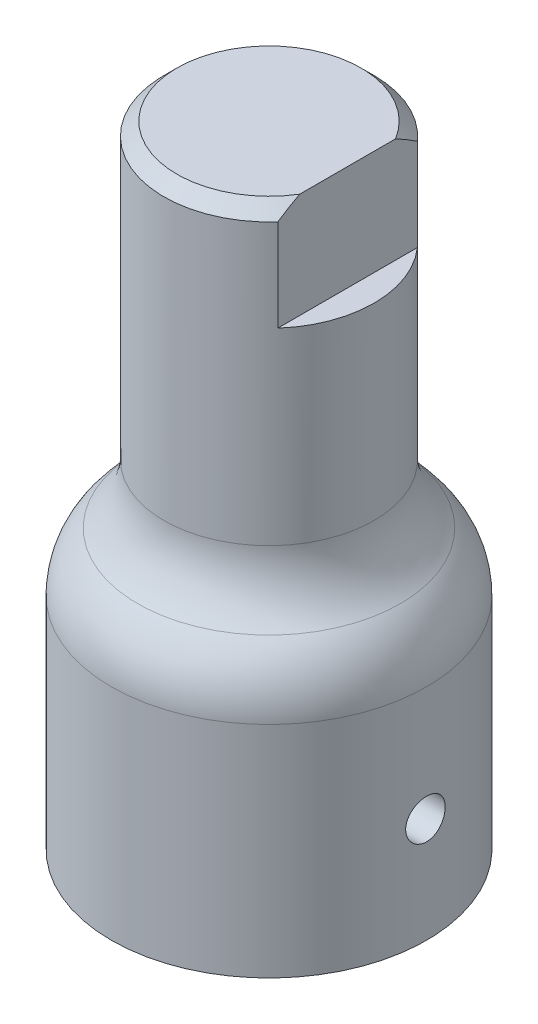
ISO-10303-21;
HEADER;
FILE_DESCRIPTION(('STEP AP214'),'2;1');
FILE_NAME('part.step','',(''),(''),'','','');
FILE_SCHEMA(('AUTOMOTIVE_DESIGN { 1 0 10303 214 1 1 1 1 }'));
ENDSEC;
DATA;
#1=APPLICATION_CONTEXT('core data for automotive mechanical design processes');
#2=APPLICATION_PROTOCOL_DEFINITION('international standard','automotive_design',2000,#1);
#3=PRODUCT_CONTEXT('',#1,'mechanical');
#4=PRODUCT('Part','Part','',(#3));
#5=PRODUCT_RELATED_PRODUCT_CATEGORY('part','',(#4));
#6=PRODUCT_DEFINITION_FORMATION('','',#4);
#7=PRODUCT_DEFINITION_CONTEXT('part definition',#1,'design');
#8=PRODUCT_DEFINITION('design','',#6,#7);
#9=PRODUCT_DEFINITION_SHAPE('','',#8);
#10=(LENGTH_UNIT() NAMED_UNIT(*) SI_UNIT(.MILLI.,.METRE.));
#11=(NAMED_UNIT(*) PLANE_ANGLE_UNIT() SI_UNIT($,.RADIAN.));
#12=(NAMED_UNIT(*) SI_UNIT($,.STERADIAN.) SOLID_ANGLE_UNIT());
#13=UNCERTAINTY_MEASURE_WITH_UNIT(LENGTH_MEASURE(1.E-05),#10,'distance_accuracy_value','');
#14=(GEOMETRIC_REPRESENTATION_CONTEXT(3) GLOBAL_UNCERTAINTY_ASSIGNED_CONTEXT((#13)) GLOBAL_UNIT_ASSIGNED_CONTEXT((#10,
#11,#12)) REPRESENTATION_CONTEXT('',''));
#15=CARTESIAN_POINT('',(0.,0.,0.));
#16=DIRECTION('',(0.,0.,1.));
#17=DIRECTION('',(1.,0.,0.));
#18=AXIS2_PLACEMENT_3D('',#15,#16,#17);
#19=CARTESIAN_POINT('',(0.,38.1,0.));
#20=DIRECTION('',(0.,-1.,0.));
#21=DIRECTION('',(0.,0.,-1.));
#22=AXIS2_PLACEMENT_3D('',#19,#20,#21);
#23=CYLINDRICAL_SURFACE('',#22,6.35);
#24=DIRECTION('',(0.,1.,0.));
#25=VECTOR('',#24,1.);
#26=CARTESIAN_POINT('',(4.7498,31.75,4.21448691539076));
#27=LINE('',#26,#25);
#28=CARTESIAN_POINT('',(4.7498,31.75,4.21448691539076));
#29=VERTEX_POINT('',#28);
#30=CARTESIAN_POINT('',(4.7498,37.3126,4.21448691539076));
#31=VERTEX_POINT('',#30);
#32=EDGE_CURVE('E111',#29,#31,#27,.T.);
#33=ORIENTED_EDGE('',*,*,#32,.T.);
#34=CARTESIAN_POINT('',(0.,37.3126,0.));
#35=DIRECTION('',(0.,1.,0.));
#36=DIRECTION('',(0.,0.,1.));
#37=AXIS2_PLACEMENT_3D('',#34,#35,#36);
#38=CIRCLE('',#37,6.35);
#39=CARTESIAN_POINT('',(4.7498,37.3126,-4.21448691539077));
#40=VERTEX_POINT('',#39);
#41=EDGE_CURVE('E135',#31,#40,#38,.F.);
#42=ORIENTED_EDGE('',*,*,#41,.T.);
#43=DIRECTION('',(0.,1.,0.));
#44=VECTOR('',#43,1.);
#45=CARTESIAN_POINT('',(4.7498,31.75,-4.21448691539077));
#46=LINE('',#45,#44);
#47=CARTESIAN_POINT('',(4.7498,31.75,-4.21448691539077));
#48=VERTEX_POINT('',#47);
#49=EDGE_CURVE('E109',#48,#40,#46,.T.);
#50=ORIENTED_EDGE('',*,*,#49,.F.);
#51=CARTESIAN_POINT('',(0.,31.75,0.));
#52=DIRECTION('',(0.,1.,0.));
#53=DIRECTION('',(0.,0.,1.));
#54=AXIS2_PLACEMENT_3D('',#51,#52,#53);
#55=CIRCLE('',#54,6.35);
#56=EDGE_CURVE('E104',#29,#48,#55,.T.);
#57=ORIENTED_EDGE('',*,*,#56,.F.);
#58=EDGE_LOOP('',(#33,#42,#50,#57));
#59=FACE_BOUND('',#58,.T.);
#60=CARTESIAN_POINT('',(0.,20.3740993543153,0.));
#61=DIRECTION('',(0.,-1.,0.));
#62=DIRECTION('',(0.,0.,-1.));
#63=AXIS2_PLACEMENT_3D('',#60,#61,#62);
#64=CIRCLE('',#63,6.35000000000001);
#65=CARTESIAN_POINT('',(0.,20.3740993543153,-6.35000000000001));
#66=VERTEX_POINT('',#65);
#67=EDGE_CURVE('E114',#66,#66,#64,.T.);
#68=ORIENTED_EDGE('',*,*,#67,.F.);
#69=EDGE_LOOP('',(#68));
#70=FACE_BOUND('',#69,.T.);
#71=ADVANCED_FACE('F32',(#59,#70),#23,.T.);
#72=CARTESIAN_POINT('',(6.35,38.1,0.));
#73=DIRECTION('',(0.,1.,0.));
#74=DIRECTION('',(0.,0.,1.));
#75=AXIS2_PLACEMENT_3D('',#72,#73,#74);
#76=PLANE('',#75);
#77=DIRECTION('',(0.,0.,1.));
#78=VECTOR('',#77,1.);
#79=CARTESIAN_POINT('',(4.7498,38.1,-4.21448691539077));
#80=LINE('',#79,#78);
#81=CARTESIAN_POINT('',(4.7498,38.1,-2.89515435167112));
#82=VERTEX_POINT('',#81);
#83=CARTESIAN_POINT('',(4.7498,38.1,2.89515435167112));
#84=VERTEX_POINT('',#83);
#85=EDGE_CURVE('E102',#82,#84,#80,.T.);
#86=ORIENTED_EDGE('',*,*,#85,.F.);
#87=CARTESIAN_POINT('',(0.,38.1,0.));
#88=DIRECTION('',(0.,1.,0.));
#89=DIRECTION('',(0.,0.,1.));
#90=AXIS2_PLACEMENT_3D('',#87,#88,#89);
#91=CIRCLE('',#90,5.56260000000002);
#92=EDGE_CURVE('E11',#82,#84,#91,.T.);
#93=ORIENTED_EDGE('',*,*,#92,.T.);
#94=EDGE_LOOP('',(#86,#93));
#95=FACE_BOUND('',#94,.T.);
#96=ADVANCED_FACE('F185',(#95),#76,.T.);
#97=CARTESIAN_POINT('',(0.,0.,0.));
#98=DIRECTION('',(0.,-1.,0.));
#99=DIRECTION('',(0.,0.,-1.));
#100=AXIS2_PLACEMENT_3D('',#97,#98,#99);
#101=PLANE('',#100);
#102=CARTESIAN_POINT('',(0.,0.,0.));
#103=DIRECTION('',(0.,-1.,0.));
#104=DIRECTION('',(0.,0.,-1.));
#105=AXIS2_PLACEMENT_3D('',#102,#103,#104);
#106=CIRCLE('',#105,6.35);
#107=CARTESIAN_POINT('',(4.7498,0.,4.21448691539076));
#108=VERTEX_POINT('',#107);
#109=CARTESIAN_POINT('',(4.7498,0.,-4.21448691539076));
#110=VERTEX_POINT('',#109);
#111=EDGE_CURVE('E83',#108,#110,#106,.T.);
#112=ORIENTED_EDGE('',*,*,#111,.F.);
#113=DIRECTION('',(0.,0.,1.));
#114=VECTOR('',#113,1.);
#115=CARTESIAN_POINT('',(4.7498,0.,-4.21448691539076));
#116=LINE('',#115,#114);
#117=EDGE_CURVE('E93',#110,#108,#116,.T.);
#118=ORIENTED_EDGE('',*,*,#117,.F.);
#119=EDGE_LOOP('',(#112,#118));
#120=FACE_BOUND('',#119,.T.);
#121=CARTESIAN_POINT('',(0.,0.,0.));
#122=DIRECTION('',(0.,-1.,0.));
#123=DIRECTION('',(0.,0.,-1.));
#124=AXIS2_PLACEMENT_3D('',#121,#122,#123);
#125=CIRCLE('',#124,9.525);
#126=CARTESIAN_POINT('',(0.,0.,-9.525));
#127=VERTEX_POINT('',#126);
#128=EDGE_CURVE('E124',#127,#127,#125,.T.);
#129=ORIENTED_EDGE('',*,*,#128,.T.);
#130=EDGE_LOOP('',(#129));
#131=FACE_BOUND('',#130,.T.);
#132=ADVANCED_FACE('F189',(#120,#131),#101,.T.);
#133=CARTESIAN_POINT('',(0.,38.1,0.));
#134=DIRECTION('',(0.,-1.,0.));
#135=DIRECTION('',(0.,0.,-1.));
#136=AXIS2_PLACEMENT_3D('',#133,#134,#135);
#137=CYLINDRICAL_SURFACE('',#136,9.525);
#138=CARTESIAN_POINT('',(9.52500000000001,5.15620000000001,0.));
#139=CARTESIAN_POINT('',(9.52499906633393,5.15620283595176,-0.0667754370927595));
#140=CARTESIAN_POINT('',(9.52429038644981,5.16182153593911,-0.133592564440605));
#141=CARTESIAN_POINT('',(9.52153149004273,5.18414687968143,-0.265367426049692));
#142=CARTESIAN_POINT('',(9.51947987393368,5.200865091425,-0.330323146585073));
#143=CARTESIAN_POINT('',(9.51426622373616,5.244889075905,-0.456448414925353));
#144=CARTESIAN_POINT('',(9.51110493832651,5.2721877114633,-0.51762048286043));
#145=CARTESIAN_POINT('',(9.50402352104194,5.33658200765826,-0.63450350010949));
#146=CARTESIAN_POINT('',(9.50010351906838,5.37367599160944,-0.690215381816632));
#147=CARTESIAN_POINT('',(9.49191805864054,5.45682745546026,-0.79491643197807));
#148=CARTESIAN_POINT('',(9.48765098944923,5.50292830543591,-0.843871034353107));
#149=CARTESIAN_POINT('',(9.47926530284555,5.60269175422189,-0.93337018896483));
#150=CARTESIAN_POINT('',(9.47514669302021,5.65635473880845,-0.973914311886643));
#151=CARTESIAN_POINT('',(9.46750838779676,5.76994385510924,-1.04557040884552));
#152=CARTESIAN_POINT('',(9.46399076707647,5.82989057420486,-1.07664998800913));
#153=CARTESIAN_POINT('',(9.45797395706645,5.95420398517649,-1.12828787594043));
#154=CARTESIAN_POINT('',(9.45547472895526,6.01857050845878,-1.14884658577483));
#155=CARTESIAN_POINT('',(9.45179305517668,6.149537618023,-1.17875409313682));
#156=CARTESIAN_POINT('',(9.45060375528388,6.21612467881391,-1.18816126126591));
#157=CARTESIAN_POINT('',(9.44965561667631,6.34994221256467,-1.19567927082564));
#158=CARTESIAN_POINT('',(9.4498967201401,6.41717265940713,-1.19379056887112));
#159=CARTESIAN_POINT('',(9.45177587435601,6.54996167391498,-1.17881836472275));
#160=CARTESIAN_POINT('',(9.45340590037559,6.61552762199898,-1.16579916937844));
#161=CARTESIAN_POINT('',(9.45786671902315,6.74353674388769,-1.12903588387259));
#162=CARTESIAN_POINT('',(9.46069753609851,6.80597985408437,-1.10529157535362));
#163=CARTESIAN_POINT('',(9.46725006865937,6.92617049382943,-1.04768298427782));
#164=CARTESIAN_POINT('',(9.47097423777249,6.98390449394819,-1.01379076530585));
#165=CARTESIAN_POINT('',(9.47889195626249,7.09288980034073,-0.936868413344563));
#166=CARTESIAN_POINT('',(9.48308552721859,7.14414080834906,-0.893837860168287));
#167=CARTESIAN_POINT('',(9.49150520562213,7.23907855234493,-0.799503970388438));
#168=CARTESIAN_POINT('',(9.495731336605,7.28271023041676,-0.748145206526462));
#169=CARTESIAN_POINT('',(9.50371268165858,7.36074204871934,-0.638803602449942));
#170=CARTESIAN_POINT('',(9.50746789463348,7.39514216746904,-0.580820746822149));
#171=CARTESIAN_POINT('',(9.51408664109903,7.4537344503723,-0.459834355321201));
#172=CARTESIAN_POINT('',(9.51694987250399,7.47792315722933,-0.396829127583732));
#173=CARTESIAN_POINT('',(9.52145930725312,7.51536222731489,-0.267607404435745));
#174=CARTESIAN_POINT('',(9.5231055678795,7.52861310538504,-0.201391060327244));
#175=CARTESIAN_POINT('',(9.52498812349274,7.54372899184481,-0.0681027909533295));
#176=CARTESIAN_POINT('',(9.5252338102757,7.54566984357767,-0.0010395943138036));
#177=CARTESIAN_POINT('',(9.52431289584841,7.53831074963159,0.132456074285859));
#178=CARTESIAN_POINT('',(9.52314632487864,7.52901104464508,0.198888559720625));
#179=CARTESIAN_POINT('',(9.51953782920002,7.49949782814167,0.329013169628924));
#180=CARTESIAN_POINT('',(9.51710013238404,7.47932048924539,0.392713625542354));
#181=CARTESIAN_POINT('',(9.51122230002441,7.42866237993011,0.515826637436894));
#182=CARTESIAN_POINT('',(9.50778213027829,7.39818125795998,0.575239047031721));
#183=CARTESIAN_POINT('',(9.50025946857067,7.32759739980978,0.688428119930082));
#184=CARTESIAN_POINT('',(9.49617373997876,7.28744561533005,0.742173978276366));
#185=CARTESIAN_POINT('',(9.4878271038743,7.19872957115728,0.842190867080791));
#186=CARTESIAN_POINT('',(9.48356618937484,7.1501649756888,0.888461599046223));
#187=CARTESIAN_POINT('',(9.47532042798572,7.04566775433998,0.972483952683192));
#188=CARTESIAN_POINT('',(9.47133730098763,6.98969454345516,1.01018529284971));
#189=CARTESIAN_POINT('',(9.46412640729675,6.87216586251836,1.07565126763209));
#190=CARTESIAN_POINT('',(9.46089862539395,6.81061050490585,1.10341610234024));
#191=CARTESIAN_POINT('',(9.45557559845436,6.68382694974683,1.14813956500274));
#192=CARTESIAN_POINT('',(9.45347738693838,6.61860887421039,1.1651265190246));
#193=CARTESIAN_POINT('',(9.45064256143378,6.48621796936088,1.1879032272318));
#194=CARTESIAN_POINT('',(9.44990588373722,6.41904523165841,1.19369350532486));
#195=CARTESIAN_POINT('',(9.44987939670947,6.28515204049117,1.19390285050628));
#196=CARTESIAN_POINT('',(9.4505795360166,6.21843169875243,1.18840091311061));
#197=CARTESIAN_POINT('',(9.45332618160548,6.08687204689658,1.16634931287982));
#198=CARTESIAN_POINT('',(9.4553726880076,6.02203273694766,1.14979964905699));
#199=CARTESIAN_POINT('',(9.46057836361699,5.89608623299099,1.10614711786605));
#200=CARTESIAN_POINT('',(9.46373712939881,5.83497769521926,1.07904807646655));
#201=CARTESIAN_POINT('',(9.47081207403943,5.71816255267193,1.01507380847755));
#202=CARTESIAN_POINT('',(9.47472826258874,5.6624560170236,0.978198456807015));
#203=CARTESIAN_POINT('',(9.482909615424,5.55762241006486,0.895425331094883));
#204=CARTESIAN_POINT('',(9.4871769445936,5.5085419846983,0.849468688981135));
#205=CARTESIAN_POINT('',(9.49556065827223,5.418759320745,0.749960302348609));
#206=CARTESIAN_POINT('',(9.49967700696157,5.37805905989685,0.696406769970906));
#207=CARTESIAN_POINT('',(9.5073123408521,5.30605952563161,0.582989947177679));
#208=CARTESIAN_POINT('',(9.51082898240688,5.27479678339242,0.523103319473923));
#209=CARTESIAN_POINT('',(9.51684491833686,5.22281637200474,0.39891943647175));
#210=CARTESIAN_POINT('',(9.51934531691388,5.20208725135372,0.334627057531768));
#211=CARTESIAN_POINT('',(9.52244469822355,5.17672112812424,0.225002223150388));
#212=CARTESIAN_POINT('',(9.52339826480289,5.16903677394111,0.180360864683001));
#213=CARTESIAN_POINT('',(9.52467622971936,5.15877526790845,0.0904860500245009));
#214=CARTESIAN_POINT('',(9.52500063272991,5.15619807812289,0.0452525982339693));
#215=CARTESIAN_POINT('',(9.52500000000001,5.15620000000001,0.));
#216=B_SPLINE_CURVE_WITH_KNOTS('',3,(#138,#139,#140,#141,#142,#143,#144,#145,#146,#147,#148,
#149,#150,#151,#152,#153,#154,#155,#156,#157,#158,#159,#160,#161,#162,#163,#164,#165,#166,#167,
#168,#169,#170,#171,#172,#173,#174,#175,#176,#177,#178,#179,#180,#181,#182,#183,#184,#185,#186,
#187,#188,#189,#190,#191,#192,#193,#194,#195,#196,#197,#198,#199,#200,#201,#202,#203,#204,#205,
#206,#207,#208,#209,#210,#211,#212,#213,#214,#215),.UNSPECIFIED.,.T.,.F.,(4,2,2,2,2,2,2,2,2,2,2,
2,2,2,2,2,2,2,2,2,2,2,2,2,2,2,2,2,2,2,2,2,2,2,2,2,2,2,4),(0.,0.200161016939101,
0.400530971246862,0.600765997685618,0.800966771766328,1.0021564359706,1.20335636742217,
1.40523741216748,1.60711076041968,1.80792270891501,2.00872654001029,2.20837799937318,
2.40803352371366,2.60824381841026,2.80846332090918,3.01007460714598,3.21168636251097,
3.41336632330053,3.61503679050939,3.81535331535247,4.01566555092253,4.2153157379614,
4.41497273748225,4.6156645228111,4.81636432007613,5.01821296945347,5.22005755395817,
5.42136943555335,5.62267189726344,5.82257093363813,6.02246998788479,6.22229661169174,
6.42212579226354,6.623295543038,6.82451271606741,7.02649906683712,7.22826535820902,
7.36391214328652,7.49955792077601),.UNSPECIFIED.);
#217=CARTESIAN_POINT('',(9.52500000000001,5.15620000000001,0.));
#218=VERTEX_POINT('',#217);
#219=EDGE_CURVE('E127',#218,#218,#216,.T.);
#220=ORIENTED_EDGE('',*,*,#219,.F.);
#221=EDGE_LOOP('',(#220));
#222=FACE_BOUND('',#221,.T.);
#223=CARTESIAN_POINT('',(0.,13.2632333732972,0.));
#224=DIRECTION('',(0.,-1.,0.));
#225=DIRECTION('',(0.,0.,-1.));
#226=AXIS2_PLACEMENT_3D('',#223,#224,#225);
#227=CIRCLE('',#226,9.525);
#228=CARTESIAN_POINT('',(0.,13.2632333732972,-9.525));
#229=VERTEX_POINT('',#228);
#230=EDGE_CURVE('E121',#229,#229,#227,.T.);
#231=ORIENTED_EDGE('',*,*,#230,.T.);
#232=EDGE_LOOP('',(#231));
#233=FACE_BOUND('',#232,.T.);
#234=ORIENTED_EDGE('',*,*,#128,.F.);
#235=EDGE_LOOP('',(#234));
#236=FACE_BOUND('',#235,.T.);
#237=ADVANCED_FACE('F137',(#222,#233,#236),#137,.T.);
#238=CARTESIAN_POINT('',(0.,13.2632333732972,0.));
#239=DIRECTION('',(0.,-1.,0.));
#240=DIRECTION('',(0.,0.,-1.));
#241=AXIS2_PLACEMENT_3D('',#238,#239,#240);
#242=DEGENERATE_TOROIDAL_SURFACE('',#241,4.7498,4.7752,.T.);
#243=CARTESIAN_POINT('',(0.,16.8186663638062,0.));
#244=DIRECTION('',(0.,-1.,0.));
#245=DIRECTION('',(0.,0.,-1.));
#246=AXIS2_PLACEMENT_3D('',#243,#244,#245);
#247=CIRCLE('',#246,7.93749999999999);
#248=CARTESIAN_POINT('',(0.,16.8186663638062,-7.93749999999999));
#249=VERTEX_POINT('',#248);
#250=EDGE_CURVE('E118',#249,#249,#247,.T.);
#251=ORIENTED_EDGE('',*,*,#250,.T.);
#252=EDGE_LOOP('',(#251));
#253=FACE_BOUND('',#252,.T.);
#254=ORIENTED_EDGE('',*,*,#230,.F.);
#255=EDGE_LOOP('',(#254));
#256=FACE_BOUND('',#255,.T.);
#257=ADVANCED_FACE('F196',(#253,#256),#242,.T.);
#258=CARTESIAN_POINT('',(0.,20.3740993543153,0.));
#259=DIRECTION('',(0.,-1.,0.));
#260=DIRECTION('',(0.,0.,-1.));
#261=AXIS2_PLACEMENT_3D('',#258,#259,#260);
#262=TOROIDAL_SURFACE('',#261,11.1252,4.77519999999999);
#263=ORIENTED_EDGE('',*,*,#67,.T.);
#264=EDGE_LOOP('',(#263));
#265=FACE_BOUND('',#264,.T.);
#266=ORIENTED_EDGE('',*,*,#250,.F.);
#267=EDGE_LOOP('',(#266));
#268=FACE_BOUND('',#267,.T.);
#269=ADVANCED_FACE('F161',(#265,#268),#262,.F.);
#270=CARTESIAN_POINT('',(4.7498,31.75,-4.21448691539077));
#271=DIRECTION('',(-1.,0.,0.));
#272=DIRECTION('',(0.,0.,1.));
#273=AXIS2_PLACEMENT_3D('',#270,#271,#272);
#274=PLANE('',#273);
#275=ORIENTED_EDGE('',*,*,#49,.T.);
#276=CARTESIAN_POINT('',(4.7498,37.3126,-4.21448691539077));
#277=CARTESIAN_POINT('',(4.7498,37.383442210857,-4.10772835149639));
#278=CARTESIAN_POINT('',(4.7498,37.453262114835,-4.00028036304212));
#279=CARTESIAN_POINT('',(4.7498,37.5904064046364,-3.78390972290215));
#280=CARTESIAN_POINT('',(4.7498,37.6577324868414,-3.67498814511076));
#281=CARTESIAN_POINT('',(4.7498,37.7895469471203,-3.45541133981242));
#282=CARTESIAN_POINT('',(4.7498,37.8540349197709,-3.34475586766081));
#283=CARTESIAN_POINT('',(4.7498,37.9796709821817,-3.12146686115062));
#284=CARTESIAN_POINT('',(4.7498,38.0408167210141,-3.00883200625417));
#285=CARTESIAN_POINT('',(4.7498,38.1,-2.89515435167112));
#286=B_SPLINE_CURVE_WITH_KNOTS('',3,(#276,#277,#278,#279,#280,#281,#282,#283,#284,#285),
.UNSPECIFIED.,.F.,.F.,(4,2,2,2,4),(0.,0.384382144107627,0.76849782831447,1.15266820644773,
1.53710542168632),.UNSPECIFIED.);
#287=EDGE_CURVE('E41',#40,#82,#286,.T.);
#288=ORIENTED_EDGE('',*,*,#287,.T.);
#289=ORIENTED_EDGE('',*,*,#85,.T.);
#290=CARTESIAN_POINT('',(4.7498,38.1,2.89515435167112));
#291=CARTESIAN_POINT('',(4.7498,38.0408167210141,3.00883200625416));
#292=CARTESIAN_POINT('',(4.7498,37.9796709821817,3.12146686115062));
#293=CARTESIAN_POINT('',(4.7498,37.8540349197709,3.34475586766081));
#294=CARTESIAN_POINT('',(4.7498,37.7895469471203,3.45541133981242));
#295=CARTESIAN_POINT('',(4.7498,37.6577324868414,3.67498814511076));
#296=CARTESIAN_POINT('',(4.7498,37.5904064046364,3.78390972290214));
#297=CARTESIAN_POINT('',(4.7498,37.453262114835,4.00028036304211));
#298=CARTESIAN_POINT('',(4.7498,37.383442210857,4.10772835149639));
#299=CARTESIAN_POINT('',(4.7498,37.3126,4.21448691539077));
#300=B_SPLINE_CURVE_WITH_KNOTS('',3,(#290,#291,#292,#293,#294,#295,#296,#297,#298,#299),
.UNSPECIFIED.,.F.,.F.,(4,2,2,2,4),(0.,0.384437215238592,0.768607593371847,1.15272327757869,
1.53710542168632),.UNSPECIFIED.);
#301=EDGE_CURVE('E163',#84,#31,#300,.T.);
#302=ORIENTED_EDGE('',*,*,#301,.T.);
#303=ORIENTED_EDGE('',*,*,#32,.F.);
#304=DIRECTION('',(0.,0.,1.));
#305=VECTOR('',#304,1.);
#306=CARTESIAN_POINT('',(4.7498,31.75,-4.21448691539077));
#307=LINE('',#306,#305);
#308=EDGE_CURVE('E106',#48,#29,#307,.T.);
#309=ORIENTED_EDGE('',*,*,#308,.F.);
#310=EDGE_LOOP('',(#275,#288,#289,#302,#303,#309));
#311=FACE_BOUND('',#310,.T.);
#312=ADVANCED_FACE('F156',(#311),#274,.F.);
#313=CARTESIAN_POINT('',(0.,31.75,0.));
#314=DIRECTION('',(0.,1.,0.));
#315=DIRECTION('',(0.,0.,1.));
#316=AXIS2_PLACEMENT_3D('',#313,#314,#315);
#317=PLANE('',#316);
#318=ORIENTED_EDGE('',*,*,#56,.T.);
#319=ORIENTED_EDGE('',*,*,#308,.T.);
#320=EDGE_LOOP('',(#318,#319));
#321=FACE_BOUND('',#320,.T.);
#322=ADVANCED_FACE('F153',(#321),#317,.T.);
#323=CARTESIAN_POINT('',(0.,12.7,0.));
#324=DIRECTION('',(0.,-1.,0.));
#325=DIRECTION('',(0.,0.,-1.));
#326=AXIS2_PLACEMENT_3D('',#323,#324,#325);
#327=CYLINDRICAL_SURFACE('',#326,6.35);
#328=ORIENTED_EDGE('',*,*,#111,.T.);
#329=DIRECTION('',(0.,-1.,0.));
#330=VECTOR('',#329,1.);
#331=CARTESIAN_POINT('',(4.7498,12.7,-4.21448691539076));
#332=LINE('',#331,#330);
#333=CARTESIAN_POINT('',(4.7498,12.7,-4.21448691539076));
#334=VERTEX_POINT('',#333);
#335=EDGE_CURVE('E77',#334,#110,#332,.T.);
#336=ORIENTED_EDGE('',*,*,#335,.F.);
#337=CARTESIAN_POINT('',(0.,12.7,0.));
#338=DIRECTION('',(0.,-1.,0.));
#339=DIRECTION('',(0.,0.,-1.));
#340=AXIS2_PLACEMENT_3D('',#337,#338,#339);
#341=CIRCLE('',#340,6.35);
#342=CARTESIAN_POINT('',(4.7498,12.7,4.21448691539076));
#343=VERTEX_POINT('',#342);
#344=EDGE_CURVE('E80',#343,#334,#341,.T.);
#345=ORIENTED_EDGE('',*,*,#344,.F.);
#346=DIRECTION('',(0.,-1.,0.));
#347=VECTOR('',#346,1.);
#348=CARTESIAN_POINT('',(4.7498,12.7,4.21448691539076));
#349=LINE('',#348,#347);
#350=EDGE_CURVE('E88',#343,#108,#349,.T.);
#351=ORIENTED_EDGE('',*,*,#350,.T.);
#352=EDGE_LOOP('',(#328,#336,#345,#351));
#353=FACE_BOUND('',#352,.T.);
#354=ADVANCED_FACE('F79',(#353),#327,.F.);
#355=CARTESIAN_POINT('',(4.7498,12.7,-4.21448691539076));
#356=DIRECTION('',(1.,0.,0.));
#357=DIRECTION('',(0.,0.,-1.));
#358=AXIS2_PLACEMENT_3D('',#355,#356,#357);
#359=PLANE('',#358);
#360=CARTESIAN_POINT('',(4.7498,6.35,0.));
#361=DIRECTION('',(-1.,0.,0.));
#362=DIRECTION('',(0.,0.,1.));
#363=AXIS2_PLACEMENT_3D('',#360,#361,#362);
#364=CIRCLE('',#363,1.19379999999999);
#365=CARTESIAN_POINT('',(4.7498,6.35,1.19379999999999));
#366=VERTEX_POINT('',#365);
#367=EDGE_CURVE('E100',#366,#366,#364,.T.);
#368=ORIENTED_EDGE('',*,*,#367,.F.);
#369=EDGE_LOOP('',(#368));
#370=FACE_BOUND('',#369,.T.);
#371=ORIENTED_EDGE('',*,*,#117,.T.);
#372=ORIENTED_EDGE('',*,*,#350,.F.);
#373=DIRECTION('',(0.,0.,1.));
#374=VECTOR('',#373,1.);
#375=CARTESIAN_POINT('',(4.7498,12.7,-4.21448691539076));
#376=LINE('',#375,#374);
#377=EDGE_CURVE('E89',#334,#343,#376,.T.);
#378=ORIENTED_EDGE('',*,*,#377,.F.);
#379=ORIENTED_EDGE('',*,*,#335,.T.);
#380=EDGE_LOOP('',(#371,#372,#378,#379));
#381=FACE_BOUND('',#380,.T.);
#382=ADVANCED_FACE('F95',(#370,#381),#359,.F.);
#383=CARTESIAN_POINT('',(0.,12.7,0.));
#384=DIRECTION('',(0.,-1.,0.));
#385=DIRECTION('',(0.,0.,-1.));
#386=AXIS2_PLACEMENT_3D('',#383,#384,#385);
#387=PLANE('',#386);
#388=ORIENTED_EDGE('',*,*,#344,.T.);
#389=ORIENTED_EDGE('',*,*,#377,.T.);
#390=EDGE_LOOP('',(#388,#389));
#391=FACE_BOUND('',#390,.T.);
#392=ADVANCED_FACE('F92',(#391),#387,.T.);
#393=CARTESIAN_POINT('',(4.7498,6.35,0.));
#394=DIRECTION('',(-1.,0.,0.));
#395=DIRECTION('',(0.,0.,1.));
#396=AXIS2_PLACEMENT_3D('',#393,#394,#395);
#397=CYLINDRICAL_SURFACE('',#396,1.19379999999999);
#398=ORIENTED_EDGE('',*,*,#219,.T.);
#399=EDGE_LOOP('',(#398));
#400=FACE_BOUND('',#399,.T.);
#401=ORIENTED_EDGE('',*,*,#367,.T.);
#402=EDGE_LOOP('',(#401));
#403=FACE_BOUND('',#402,.T.);
#404=ADVANCED_FACE('F141',(#400,#403),#397,.F.);
#405=CARTESIAN_POINT('',(0.,37.3126,0.));
#406=DIRECTION('',(0.,-1.,0.));
#407=DIRECTION('',(0.,0.,-1.));
#408=AXIS2_PLACEMENT_3D('',#405,#406,#407);
#409=CONICAL_SURFACE('',#408,6.35,0.785398163397446);
#410=ORIENTED_EDGE('',*,*,#301,.F.);
#411=ORIENTED_EDGE('',*,*,#92,.F.);
#412=ORIENTED_EDGE('',*,*,#287,.F.);
#413=ORIENTED_EDGE('',*,*,#41,.F.);
#414=EDGE_LOOP('',(#410,#411,#412,#413));
#415=FACE_BOUND('',#414,.T.);
#416=ADVANCED_FACE('F34',(#415),#409,.T.);
#417=CLOSED_SHELL('',(#71,#96,#132,#237,#257,#269,#312,#322,#354,#382,#392,#404,#416));
#418=MANIFOLD_SOLID_BREP('B2',#417);
#419=ADVANCED_BREP_SHAPE_REPRESENTATION('',(#18,#418),#14);
#420=SHAPE_DEFINITION_REPRESENTATION(#9,#419);
ENDSEC;
END-ISO-10303-21;
